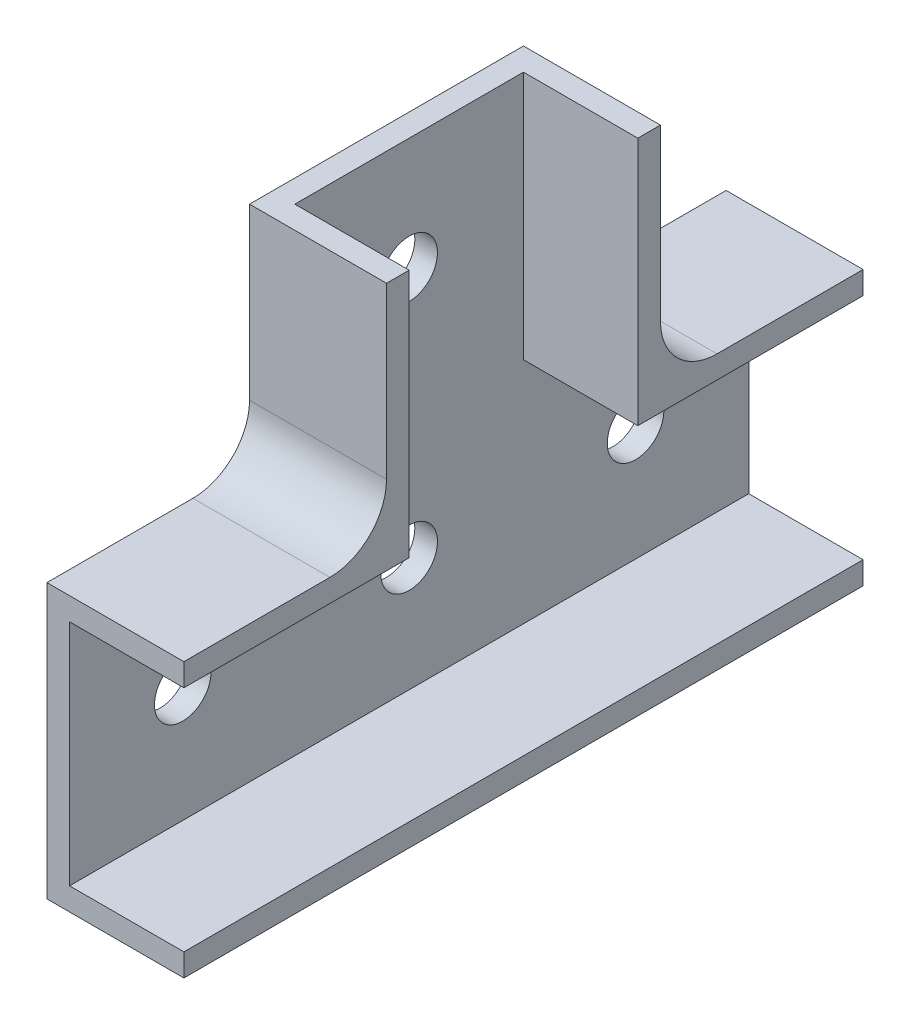
ISO-10303-21;
HEADER;
FILE_DESCRIPTION(('STEP AP214'),'2;1');
FILE_NAME('part.step','',(''),(''),'','','');
FILE_SCHEMA(('AUTOMOTIVE_DESIGN { 1 0 10303 214 1 1 1 1 }'));
ENDSEC;
DATA;
#1=APPLICATION_CONTEXT('core data for automotive mechanical design processes');
#2=APPLICATION_PROTOCOL_DEFINITION('international standard','automotive_design',2000,#1);
#3=PRODUCT_CONTEXT('',#1,'mechanical');
#4=PRODUCT('Part','Part','',(#3));
#5=PRODUCT_RELATED_PRODUCT_CATEGORY('part','',(#4));
#6=PRODUCT_DEFINITION_FORMATION('','',#4);
#7=PRODUCT_DEFINITION_CONTEXT('part definition',#1,'design');
#8=PRODUCT_DEFINITION('design','',#6,#7);
#9=PRODUCT_DEFINITION_SHAPE('','',#8);
#10=(LENGTH_UNIT() NAMED_UNIT(*) SI_UNIT(.MILLI.,.METRE.));
#11=(NAMED_UNIT(*) PLANE_ANGLE_UNIT() SI_UNIT($,.RADIAN.));
#12=(NAMED_UNIT(*) SI_UNIT($,.STERADIAN.) SOLID_ANGLE_UNIT());
#13=UNCERTAINTY_MEASURE_WITH_UNIT(LENGTH_MEASURE(1.E-05),#10,'distance_accuracy_value','');
#14=(GEOMETRIC_REPRESENTATION_CONTEXT(3) GLOBAL_UNCERTAINTY_ASSIGNED_CONTEXT((#13)) GLOBAL_UNIT_ASSIGNED_CONTEXT((#10,
#11,#12)) REPRESENTATION_CONTEXT('',''));
#15=CARTESIAN_POINT('',(0.,0.,0.));
#16=DIRECTION('',(0.,0.,1.));
#17=DIRECTION('',(1.,0.,0.));
#18=AXIS2_PLACEMENT_3D('',#15,#16,#17);
#19=CARTESIAN_POINT('',(-12.1,17.1,67.1));
#20=DIRECTION('',(1.,0.,0.));
#21=DIRECTION('',(0.,1.,0.));
#22=AXIS2_PLACEMENT_3D('',#19,#20,#21);
#23=CYLINDRICAL_SURFACE('',#22,5.);
#24=DIRECTION('',(-1.,0.,0.));
#25=VECTOR('',#24,1.);
#26=CARTESIAN_POINT('',(-12.1,12.1,67.1));
#27=LINE('',#26,#25);
#28=CARTESIAN_POINT('',(0.,12.1,67.1));
#29=VERTEX_POINT('',#28);
#30=CARTESIAN_POINT('',(-12.1,12.1,67.1));
#31=VERTEX_POINT('',#30);
#32=EDGE_CURVE('E260',#29,#31,#27,.T.);
#33=ORIENTED_EDGE('',*,*,#32,.F.);
#34=CARTESIAN_POINT('',(0.,17.1,67.1));
#35=DIRECTION('',(1.,0.,0.));
#36=DIRECTION('',(0.,1.,0.));
#37=AXIS2_PLACEMENT_3D('',#34,#35,#36);
#38=CIRCLE('',#37,5.);
#39=CARTESIAN_POINT('',(0.,17.1,62.1));
#40=VERTEX_POINT('',#39);
#41=EDGE_CURVE('E52',#29,#40,#38,.T.);
#42=ORIENTED_EDGE('',*,*,#41,.T.);
#43=DIRECTION('',(-1.,0.,0.));
#44=VECTOR('',#43,1.);
#45=CARTESIAN_POINT('',(-12.1,17.1,62.1));
#46=LINE('',#45,#44);
#47=CARTESIAN_POINT('',(-12.1,17.1,62.1));
#48=VERTEX_POINT('',#47);
#49=EDGE_CURVE('E264',#48,#40,#46,.F.);
#50=ORIENTED_EDGE('',*,*,#49,.F.);
#51=CARTESIAN_POINT('',(-12.1,17.1,67.1));
#52=DIRECTION('',(1.,0.,0.));
#53=DIRECTION('',(0.,0.,-1.));
#54=AXIS2_PLACEMENT_3D('',#51,#52,#53);
#55=CIRCLE('',#54,5.);
#56=EDGE_CURVE('E11',#48,#31,#55,.F.);
#57=ORIENTED_EDGE('',*,*,#56,.T.);
#58=EDGE_LOOP('',(#33,#42,#50,#57));
#59=FACE_BOUND('',#58,.T.);
#60=ADVANCED_FACE('F44',(#59),#23,.F.);
#61=CARTESIAN_POINT('',(-12.1,17.1,32.9));
#62=DIRECTION('',(1.,0.,0.));
#63=DIRECTION('',(0.,1.,0.));
#64=AXIS2_PLACEMENT_3D('',#61,#62,#63);
#65=CYLINDRICAL_SURFACE('',#64,5.);
#66=DIRECTION('',(-1.,0.,0.));
#67=VECTOR('',#66,1.);
#68=CARTESIAN_POINT('',(-12.1,17.1,37.9));
#69=LINE('',#68,#67);
#70=CARTESIAN_POINT('',(0.,17.1,37.9));
#71=VERTEX_POINT('',#70);
#72=CARTESIAN_POINT('',(-12.1,17.1,37.9));
#73=VERTEX_POINT('',#72);
#74=EDGE_CURVE('E246',#71,#73,#69,.T.);
#75=ORIENTED_EDGE('',*,*,#74,.F.);
#76=CARTESIAN_POINT('',(0.,17.1,32.9));
#77=DIRECTION('',(1.,0.,0.));
#78=DIRECTION('',(0.,1.,0.));
#79=AXIS2_PLACEMENT_3D('',#76,#77,#78);
#80=CIRCLE('',#79,5.);
#81=CARTESIAN_POINT('',(0.,12.1,32.9));
#82=VERTEX_POINT('',#81);
#83=EDGE_CURVE('E254',#71,#82,#80,.T.);
#84=ORIENTED_EDGE('',*,*,#83,.T.);
#85=DIRECTION('',(-1.,0.,0.));
#86=VECTOR('',#85,1.);
#87=CARTESIAN_POINT('',(-12.1,12.1,32.9));
#88=LINE('',#87,#86);
#89=CARTESIAN_POINT('',(-12.1,12.1,32.9));
#90=VERTEX_POINT('',#89);
#91=EDGE_CURVE('E250',#90,#82,#88,.F.);
#92=ORIENTED_EDGE('',*,*,#91,.F.);
#93=CARTESIAN_POINT('',(-12.1,17.1,32.9));
#94=DIRECTION('',(1.,0.,0.));
#95=DIRECTION('',(0.,0.,-1.));
#96=AXIS2_PLACEMENT_3D('',#93,#94,#95);
#97=CIRCLE('',#96,5.);
#98=EDGE_CURVE('E257',#90,#73,#97,.F.);
#99=ORIENTED_EDGE('',*,*,#98,.T.);
#100=EDGE_LOOP('',(#75,#84,#92,#99));
#101=FACE_BOUND('',#100,.T.);
#102=ADVANCED_FACE('F438',(#101),#65,.F.);
#103=CARTESIAN_POINT('',(-10.1,10.1,100.));
#104=DIRECTION('',(0.,-1.,0.));
#105=DIRECTION('',(0.,0.,-1.));
#106=AXIS2_PLACEMENT_3D('',#103,#104,#105);
#107=PLANE('',#106);
#108=DIRECTION('',(0.,0.,-1.));
#109=VECTOR('',#108,1.);
#110=CARTESIAN_POINT('',(-10.1,10.1,100.));
#111=LINE('',#110,#109);
#112=CARTESIAN_POINT('',(-10.1,10.1,80.));
#113=VERTEX_POINT('',#112);
#114=CARTESIAN_POINT('',(-10.1,10.1,60.1));
#115=VERTEX_POINT('',#114);
#116=EDGE_CURVE('E174',#113,#115,#111,.T.);
#117=ORIENTED_EDGE('',*,*,#116,.T.);
#118=DIRECTION('',(1.,0.,0.));
#119=VECTOR('',#118,1.);
#120=CARTESIAN_POINT('',(-10.,10.1,60.1));
#121=LINE('',#120,#119);
#122=CARTESIAN_POINT('',(0.,10.1,60.1));
#123=VERTEX_POINT('',#122);
#124=EDGE_CURVE('E184',#115,#123,#121,.T.);
#125=ORIENTED_EDGE('',*,*,#124,.T.);
#126=DIRECTION('',(0.,0.,1.));
#127=VECTOR('',#126,1.);
#128=CARTESIAN_POINT('',(0.,10.1,100.));
#129=LINE('',#128,#127);
#130=CARTESIAN_POINT('',(0.,10.1,80.));
#131=VERTEX_POINT('',#130);
#132=EDGE_CURVE('E286',#123,#131,#129,.T.);
#133=ORIENTED_EDGE('',*,*,#132,.T.);
#134=DIRECTION('',(-1.,0.,0.));
#135=VECTOR('',#134,1.);
#136=CARTESIAN_POINT('',(-10.1,10.1,80.));
#137=LINE('',#136,#135);
#138=EDGE_CURVE('E194',#131,#113,#137,.T.);
#139=ORIENTED_EDGE('',*,*,#138,.T.);
#140=EDGE_LOOP('',(#117,#125,#133,#139));
#141=FACE_BOUND('',#140,.T.);
#142=ADVANCED_FACE('F192',(#141),#107,.T.);
#143=CARTESIAN_POINT('',(0.,0.,0.));
#144=DIRECTION('',(1.,0.,0.));
#145=DIRECTION('',(0.,1.,0.));
#146=AXIS2_PLACEMENT_3D('',#143,#144,#145);
#147=PLANE('',#146);
#148=ORIENTED_EDGE('',*,*,#41,.F.);
#149=DIRECTION('',(0.,0.,1.));
#150=VECTOR('',#149,1.);
#151=CARTESIAN_POINT('',(0.,12.1,100.));
#152=LINE('',#151,#150);
#153=CARTESIAN_POINT('',(0.,12.1,80.));
#154=VERTEX_POINT('',#153);
#155=EDGE_CURVE('E388',#29,#154,#152,.T.);
#156=ORIENTED_EDGE('',*,*,#155,.T.);
#157=DIRECTION('',(0.,1.,0.));
#158=VECTOR('',#157,1.);
#159=CARTESIAN_POINT('',(0.,0.,80.));
#160=LINE('',#159,#158);
#161=EDGE_CURVE('E287',#131,#154,#160,.T.);
#162=ORIENTED_EDGE('',*,*,#161,.F.);
#163=ORIENTED_EDGE('',*,*,#132,.F.);
#164=DIRECTION('',(0.,-1.,0.));
#165=VECTOR('',#164,1.);
#166=CARTESIAN_POINT('',(0.,52.1,60.1));
#167=LINE('',#166,#165);
#168=CARTESIAN_POINT('',(0.,32.1,60.1));
#169=VERTEX_POINT('',#168);
#170=EDGE_CURVE('E186',#169,#123,#167,.T.);
#171=ORIENTED_EDGE('',*,*,#170,.F.);
#172=DIRECTION('',(0.,0.,1.));
#173=VECTOR('',#172,1.);
#174=CARTESIAN_POINT('',(0.,32.1,0.));
#175=LINE('',#174,#173);
#176=CARTESIAN_POINT('',(0.,32.1,62.1));
#177=VERTEX_POINT('',#176);
#178=EDGE_CURVE('E242',#169,#177,#175,.T.);
#179=ORIENTED_EDGE('',*,*,#178,.T.);
#180=DIRECTION('',(0.,-1.,0.));
#181=VECTOR('',#180,1.);
#182=CARTESIAN_POINT('',(0.,52.1,62.1));
#183=LINE('',#182,#181);
#184=EDGE_CURVE('E382',#177,#40,#183,.T.);
#185=ORIENTED_EDGE('',*,*,#184,.T.);
#186=EDGE_LOOP('',(#148,#156,#162,#163,#171,#179,#185));
#187=FACE_BOUND('',#186,.T.);
#188=ADVANCED_FACE('F445',(#187),#147,.T.);
#189=CARTESIAN_POINT('',(-12.1,12.1,100.));
#190=DIRECTION('',(0.,-1.,0.));
#191=DIRECTION('',(1.,0.,0.));
#192=AXIS2_PLACEMENT_3D('',#189,#190,#191);
#193=PLANE('',#192);
#194=ORIENTED_EDGE('',*,*,#155,.F.);
#195=ORIENTED_EDGE('',*,*,#32,.T.);
#196=DIRECTION('',(0.,0.,-1.));
#197=VECTOR('',#196,1.);
#198=CARTESIAN_POINT('',(-12.1,12.1,100.));
#199=LINE('',#198,#197);
#200=CARTESIAN_POINT('',(-12.1,12.1,80.));
#201=VERTEX_POINT('',#200);
#202=EDGE_CURVE('E202',#201,#31,#199,.T.);
#203=ORIENTED_EDGE('',*,*,#202,.F.);
#204=DIRECTION('',(1.,0.,0.));
#205=VECTOR('',#204,1.);
#206=CARTESIAN_POINT('',(-27.9,12.1,80.));
#207=LINE('',#206,#205);
#208=EDGE_CURVE('E296',#201,#154,#207,.T.);
#209=ORIENTED_EDGE('',*,*,#208,.T.);
#210=EDGE_LOOP('',(#194,#195,#203,#209));
#211=FACE_BOUND('',#210,.T.);
#212=ADVANCED_FACE('F452',(#211),#193,.F.);
#213=CARTESIAN_POINT('',(-12.1,-12.1,100.));
#214=DIRECTION('',(0.,1.,0.));
#215=DIRECTION('',(0.,0.,1.));
#216=AXIS2_PLACEMENT_3D('',#213,#214,#215);
#217=PLANE('',#216);
#218=DIRECTION('',(0.,0.,-1.));
#219=VECTOR('',#218,1.);
#220=CARTESIAN_POINT('',(0.,-12.1,100.));
#221=LINE('',#220,#219);
#222=CARTESIAN_POINT('',(0.,-12.1,80.));
#223=VERTEX_POINT('',#222);
#224=CARTESIAN_POINT('',(0.,-12.1,19.9999999999996));
#225=VERTEX_POINT('',#224);
#226=EDGE_CURVE('E407',#223,#225,#221,.T.);
#227=ORIENTED_EDGE('',*,*,#226,.F.);
#228=DIRECTION('',(1.,0.,0.));
#229=VECTOR('',#228,1.);
#230=CARTESIAN_POINT('',(-27.9,-12.1,80.));
#231=LINE('',#230,#229);
#232=CARTESIAN_POINT('',(-12.1,-12.1,80.));
#233=VERTEX_POINT('',#232);
#234=EDGE_CURVE('E311',#233,#223,#231,.T.);
#235=ORIENTED_EDGE('',*,*,#234,.F.);
#236=DIRECTION('',(0.,0.,-1.));
#237=VECTOR('',#236,1.);
#238=CARTESIAN_POINT('',(-12.1,-12.1,100.));
#239=LINE('',#238,#237);
#240=CARTESIAN_POINT('',(-12.1,-12.1,19.9999999999996));
#241=VERTEX_POINT('',#240);
#242=EDGE_CURVE('E209',#233,#241,#239,.T.);
#243=ORIENTED_EDGE('',*,*,#242,.T.);
#244=DIRECTION('',(1.,0.,0.));
#245=VECTOR('',#244,1.);
#246=CARTESIAN_POINT('',(-27.9,-12.1,19.9999999999996));
#247=LINE('',#246,#245);
#248=EDGE_CURVE('E302',#241,#225,#247,.T.);
#249=ORIENTED_EDGE('',*,*,#248,.T.);
#250=EDGE_LOOP('',(#227,#235,#243,#249));
#251=FACE_BOUND('',#250,.T.);
#252=ADVANCED_FACE('F424',(#251),#217,.F.);
#253=DIRECTION('',(1.,0.,0.));
#254=VECTOR('',#253,1.);
#255=CARTESIAN_POINT('',(-10.,10.1,39.9));
#256=LINE('',#255,#254);
#257=CARTESIAN_POINT('',(-10.1,10.1,39.9));
#258=VERTEX_POINT('',#257);
#259=CARTESIAN_POINT('',(0.,10.1,39.9));
#260=VERTEX_POINT('',#259);
#261=EDGE_CURVE('E190',#258,#260,#256,.T.);
#262=ORIENTED_EDGE('',*,*,#261,.F.);
#263=CARTESIAN_POINT('',(-10.1,10.1,19.9999999999997));
#264=VERTEX_POINT('',#263);
#265=EDGE_CURVE('E198',#258,#264,#111,.T.);
#266=ORIENTED_EDGE('',*,*,#265,.T.);
#267=DIRECTION('',(-1.,0.,0.));
#268=VECTOR('',#267,1.);
#269=CARTESIAN_POINT('',(-10.1,10.1,19.9999999999997));
#270=LINE('',#269,#268);
#271=CARTESIAN_POINT('',(0.,10.1,19.9999999999997));
#272=VERTEX_POINT('',#271);
#273=EDGE_CURVE('E328',#272,#264,#270,.T.);
#274=ORIENTED_EDGE('',*,*,#273,.F.);
#275=EDGE_CURVE('E378',#272,#260,#129,.T.);
#276=ORIENTED_EDGE('',*,*,#275,.T.);
#277=EDGE_LOOP('',(#262,#266,#274,#276));
#278=FACE_BOUND('',#277,.T.);
#279=ADVANCED_FACE('F377',(#278),#107,.T.);
#280=CARTESIAN_POINT('',(-10.1,-10.1,100.));
#281=DIRECTION('',(0.,1.,0.));
#282=DIRECTION('',(0.,0.,1.));
#283=AXIS2_PLACEMENT_3D('',#280,#281,#282);
#284=PLANE('',#283);
#285=DIRECTION('',(1.,0.,0.));
#286=VECTOR('',#285,1.);
#287=CARTESIAN_POINT('',(-10.1,-10.1,80.));
#288=LINE('',#287,#286);
#289=CARTESIAN_POINT('',(-10.1,-10.1,80.));
#290=VERTEX_POINT('',#289);
#291=CARTESIAN_POINT('',(0.,-10.1,80.));
#292=VERTEX_POINT('',#291);
#293=EDGE_CURVE('E213',#290,#292,#288,.T.);
#294=ORIENTED_EDGE('',*,*,#293,.T.);
#295=DIRECTION('',(0.,0.,-1.));
#296=VECTOR('',#295,1.);
#297=CARTESIAN_POINT('',(0.,-10.1,100.));
#298=LINE('',#297,#296);
#299=CARTESIAN_POINT('',(0.,-10.1,19.9999999999996));
#300=VERTEX_POINT('',#299);
#301=EDGE_CURVE('E368',#292,#300,#298,.T.);
#302=ORIENTED_EDGE('',*,*,#301,.T.);
#303=DIRECTION('',(1.,0.,0.));
#304=VECTOR('',#303,1.);
#305=CARTESIAN_POINT('',(-10.1,-10.1,19.9999999999996));
#306=LINE('',#305,#304);
#307=CARTESIAN_POINT('',(-10.1,-10.1,19.9999999999996));
#308=VERTEX_POINT('',#307);
#309=EDGE_CURVE('E235',#308,#300,#306,.T.);
#310=ORIENTED_EDGE('',*,*,#309,.F.);
#311=DIRECTION('',(0.,0.,-1.));
#312=VECTOR('',#311,1.);
#313=CARTESIAN_POINT('',(-10.1,-10.1,100.));
#314=LINE('',#313,#312);
#315=EDGE_CURVE('E204',#290,#308,#314,.T.);
#316=ORIENTED_EDGE('',*,*,#315,.F.);
#317=EDGE_LOOP('',(#294,#302,#310,#316));
#318=FACE_BOUND('',#317,.T.);
#319=ADVANCED_FACE('F366',(#318),#284,.T.);
#320=CARTESIAN_POINT('',(-12.1,12.1,19.9999999999997));
#321=VERTEX_POINT('',#320);
#322=EDGE_CURVE('E197',#90,#321,#199,.T.);
#323=ORIENTED_EDGE('',*,*,#322,.F.);
#324=ORIENTED_EDGE('',*,*,#91,.T.);
#325=DIRECTION('',(0.,0.,1.));
#326=VECTOR('',#325,1.);
#327=CARTESIAN_POINT('',(0.,12.1,100.));
#328=LINE('',#327,#326);
#329=CARTESIAN_POINT('',(0.,12.1,19.9999999999997));
#330=VERTEX_POINT('',#329);
#331=EDGE_CURVE('E401',#330,#82,#328,.T.);
#332=ORIENTED_EDGE('',*,*,#331,.F.);
#333=DIRECTION('',(1.,0.,0.));
#334=VECTOR('',#333,1.);
#335=CARTESIAN_POINT('',(-27.9,12.1,19.9999999999997));
#336=LINE('',#335,#334);
#337=EDGE_CURVE('E307',#321,#330,#336,.T.);
#338=ORIENTED_EDGE('',*,*,#337,.F.);
#339=EDGE_LOOP('',(#323,#324,#332,#338));
#340=FACE_BOUND('',#339,.T.);
#341=ADVANCED_FACE('F434',(#340),#193,.F.);
#342=CARTESIAN_POINT('',(-12.1,52.1,62.1));
#343=DIRECTION('',(0.,0.,-1.));
#344=DIRECTION('',(-1.,0.,0.));
#345=AXIS2_PLACEMENT_3D('',#342,#343,#344);
#346=PLANE('',#345);
#347=DIRECTION('',(0.,-1.,0.));
#348=VECTOR('',#347,1.);
#349=CARTESIAN_POINT('',(-12.1,52.1,62.1));
#350=LINE('',#349,#348);
#351=CARTESIAN_POINT('',(-12.1,32.1,62.1));
#352=VERTEX_POINT('',#351);
#353=EDGE_CURVE('E354',#352,#48,#350,.T.);
#354=ORIENTED_EDGE('',*,*,#353,.T.);
#355=ORIENTED_EDGE('',*,*,#49,.T.);
#356=ORIENTED_EDGE('',*,*,#184,.F.);
#357=DIRECTION('',(1.,0.,0.));
#358=VECTOR('',#357,1.);
#359=CARTESIAN_POINT('',(-27.9,32.1,62.1));
#360=LINE('',#359,#358);
#361=EDGE_CURVE('E411',#352,#177,#360,.T.);
#362=ORIENTED_EDGE('',*,*,#361,.F.);
#363=EDGE_LOOP('',(#354,#355,#356,#362));
#364=FACE_BOUND('',#363,.T.);
#365=ADVANCED_FACE('F443',(#364),#346,.F.);
#366=CARTESIAN_POINT('',(-12.1,52.1,37.9));
#367=DIRECTION('',(0.,0.,1.));
#368=DIRECTION('',(1.,0.,0.));
#369=AXIS2_PLACEMENT_3D('',#366,#367,#368);
#370=PLANE('',#369);
#371=DIRECTION('',(0.,1.,0.));
#372=VECTOR('',#371,1.);
#373=CARTESIAN_POINT('',(0.,52.1,37.9));
#374=LINE('',#373,#372);
#375=CARTESIAN_POINT('',(0.,32.1,37.9));
#376=VERTEX_POINT('',#375);
#377=EDGE_CURVE('E275',#71,#376,#374,.T.);
#378=ORIENTED_EDGE('',*,*,#377,.F.);
#379=ORIENTED_EDGE('',*,*,#74,.T.);
#380=DIRECTION('',(0.,-1.,0.));
#381=VECTOR('',#380,1.);
#382=CARTESIAN_POINT('',(-12.1,52.1,37.9));
#383=LINE('',#382,#381);
#384=CARTESIAN_POINT('',(-12.1,32.1,37.9));
#385=VERTEX_POINT('',#384);
#386=EDGE_CURVE('E351',#385,#73,#383,.T.);
#387=ORIENTED_EDGE('',*,*,#386,.F.);
#388=DIRECTION('',(1.,0.,0.));
#389=VECTOR('',#388,1.);
#390=CARTESIAN_POINT('',(-27.9,32.1,37.9));
#391=LINE('',#390,#389);
#392=EDGE_CURVE('E298',#385,#376,#391,.T.);
#393=ORIENTED_EDGE('',*,*,#392,.T.);
#394=EDGE_LOOP('',(#378,#379,#387,#393));
#395=FACE_BOUND('',#394,.T.);
#396=ADVANCED_FACE('F441',(#395),#370,.F.);
#397=CARTESIAN_POINT('',(-10.1,52.1,39.9));
#398=DIRECTION('',(0.,0.,1.));
#399=DIRECTION('',(1.,0.,0.));
#400=AXIS2_PLACEMENT_3D('',#397,#398,#399);
#401=PLANE('',#400);
#402=DIRECTION('',(0.,-1.,0.));
#403=VECTOR('',#402,1.);
#404=CARTESIAN_POINT('',(-10.1,52.1,39.9));
#405=LINE('',#404,#403);
#406=CARTESIAN_POINT('',(-10.1,32.1,39.9));
#407=VERTEX_POINT('',#406);
#408=EDGE_CURVE('E180',#407,#258,#405,.T.);
#409=ORIENTED_EDGE('',*,*,#408,.T.);
#410=ORIENTED_EDGE('',*,*,#261,.T.);
#411=DIRECTION('',(0.,1.,0.));
#412=VECTOR('',#411,1.);
#413=CARTESIAN_POINT('',(0.,52.1,39.9));
#414=LINE('',#413,#412);
#415=CARTESIAN_POINT('',(0.,32.1,39.9));
#416=VERTEX_POINT('',#415);
#417=EDGE_CURVE('E272',#260,#416,#414,.T.);
#418=ORIENTED_EDGE('',*,*,#417,.T.);
#419=DIRECTION('',(1.,0.,0.));
#420=VECTOR('',#419,1.);
#421=CARTESIAN_POINT('',(-10.1,32.1,39.9));
#422=LINE('',#421,#420);
#423=EDGE_CURVE('E282',#407,#416,#422,.T.);
#424=ORIENTED_EDGE('',*,*,#423,.F.);
#425=EDGE_LOOP('',(#409,#410,#418,#424));
#426=FACE_BOUND('',#425,.T.);
#427=ADVANCED_FACE('F281',(#426),#401,.T.);
#428=CARTESIAN_POINT('',(-10.1,52.1,60.1));
#429=DIRECTION('',(0.,0.,-1.));
#430=DIRECTION('',(-1.,0.,0.));
#431=AXIS2_PLACEMENT_3D('',#428,#429,#430);
#432=PLANE('',#431);
#433=DIRECTION('',(-1.,0.,0.));
#434=VECTOR('',#433,1.);
#435=CARTESIAN_POINT('',(-10.1,32.1,60.1));
#436=LINE('',#435,#434);
#437=CARTESIAN_POINT('',(-10.1,32.1,60.1));
#438=VERTEX_POINT('',#437);
#439=EDGE_CURVE('E239',#169,#438,#436,.T.);
#440=ORIENTED_EDGE('',*,*,#439,.F.);
#441=ORIENTED_EDGE('',*,*,#170,.T.);
#442=ORIENTED_EDGE('',*,*,#124,.F.);
#443=DIRECTION('',(0.,-1.,0.));
#444=VECTOR('',#443,1.);
#445=CARTESIAN_POINT('',(-10.1,52.1,60.1));
#446=LINE('',#445,#444);
#447=EDGE_CURVE('E168',#438,#115,#446,.T.);
#448=ORIENTED_EDGE('',*,*,#447,.F.);
#449=EDGE_LOOP('',(#440,#441,#442,#448));
#450=FACE_BOUND('',#449,.T.);
#451=ADVANCED_FACE('F185',(#450),#432,.T.);
#452=CARTESIAN_POINT('',(-27.9,0.,80.));
#453=DIRECTION('',(0.,0.,1.));
#454=DIRECTION('',(1.,0.,0.));
#455=AXIS2_PLACEMENT_3D('',#452,#453,#454);
#456=PLANE('',#455);
#457=ORIENTED_EDGE('',*,*,#234,.T.);
#458=EDGE_CURVE('E393',#223,#292,#160,.T.);
#459=ORIENTED_EDGE('',*,*,#458,.T.);
#460=ORIENTED_EDGE('',*,*,#293,.F.);
#461=DIRECTION('',(0.,-1.,0.));
#462=VECTOR('',#461,1.);
#463=CARTESIAN_POINT('',(-10.1,-10.1,80.));
#464=LINE('',#463,#462);
#465=EDGE_CURVE('E306',#113,#290,#464,.T.);
#466=ORIENTED_EDGE('',*,*,#465,.F.);
#467=ORIENTED_EDGE('',*,*,#138,.F.);
#468=ORIENTED_EDGE('',*,*,#161,.T.);
#469=ORIENTED_EDGE('',*,*,#208,.F.);
#470=DIRECTION('',(0.,-1.,0.));
#471=VECTOR('',#470,1.);
#472=CARTESIAN_POINT('',(-12.1,-12.1,80.));
#473=LINE('',#472,#471);
#474=EDGE_CURVE('E322',#201,#233,#473,.T.);
#475=ORIENTED_EDGE('',*,*,#474,.T.);
#476=EDGE_LOOP('',(#457,#459,#460,#466,#467,#468,#469,#475));
#477=FACE_BOUND('',#476,.T.);
#478=ADVANCED_FACE('F418',(#477),#456,.T.);
#479=CARTESIAN_POINT('',(-27.9,-1.29831423545921E-13,19.9999999999997));
#480=DIRECTION('',(0.,0.,1.));
#481=DIRECTION('',(0.,-1.,0.));
#482=AXIS2_PLACEMENT_3D('',#479,#480,#481);
#483=PLANE('',#482);
#484=DIRECTION('',(0.,1.,0.));
#485=VECTOR('',#484,1.);
#486=CARTESIAN_POINT('',(0.,-1.31820443768167E-13,19.9999999999997));
#487=LINE('',#486,#485);
#488=EDGE_CURVE('E372',#225,#300,#487,.T.);
#489=ORIENTED_EDGE('',*,*,#488,.F.);
#490=ORIENTED_EDGE('',*,*,#248,.F.);
#491=DIRECTION('',(0.,-1.,0.));
#492=VECTOR('',#491,1.);
#493=CARTESIAN_POINT('',(-12.1,-12.0999999999995,19.9999999999996));
#494=LINE('',#493,#492);
#495=EDGE_CURVE('E231',#321,#241,#494,.T.);
#496=ORIENTED_EDGE('',*,*,#495,.F.);
#497=ORIENTED_EDGE('',*,*,#337,.T.);
#498=EDGE_CURVE('E375',#272,#330,#487,.T.);
#499=ORIENTED_EDGE('',*,*,#498,.F.);
#500=ORIENTED_EDGE('',*,*,#273,.T.);
#501=DIRECTION('',(0.,-1.,0.));
#502=VECTOR('',#501,1.);
#503=CARTESIAN_POINT('',(-10.1,-10.0999999999995,19.9999999999996));
#504=LINE('',#503,#502);
#505=EDGE_CURVE('E325',#264,#308,#504,.T.);
#506=ORIENTED_EDGE('',*,*,#505,.T.);
#507=ORIENTED_EDGE('',*,*,#309,.T.);
#508=EDGE_LOOP('',(#489,#490,#496,#497,#499,#500,#506,#507));
#509=FACE_BOUND('',#508,.T.);
#510=ADVANCED_FACE('F371',(#509),#483,.F.);
#511=CARTESIAN_POINT('',(-27.9,32.1,0.));
#512=DIRECTION('',(0.,-1.,0.));
#513=DIRECTION('',(1.,0.,0.));
#514=AXIS2_PLACEMENT_3D('',#511,#512,#513);
#515=PLANE('',#514);
#516=EDGE_CURVE('E245',#376,#416,#175,.T.);
#517=ORIENTED_EDGE('',*,*,#516,.F.);
#518=ORIENTED_EDGE('',*,*,#392,.F.);
#519=DIRECTION('',(0.,0.,-1.));
#520=VECTOR('',#519,1.);
#521=CARTESIAN_POINT('',(-12.1,32.1,100.));
#522=LINE('',#521,#520);
#523=EDGE_CURVE('E291',#352,#385,#522,.T.);
#524=ORIENTED_EDGE('',*,*,#523,.F.);
#525=ORIENTED_EDGE('',*,*,#361,.T.);
#526=ORIENTED_EDGE('',*,*,#178,.F.);
#527=ORIENTED_EDGE('',*,*,#439,.T.);
#528=DIRECTION('',(0.,0.,-1.));
#529=VECTOR('',#528,1.);
#530=CARTESIAN_POINT('',(-10.1,32.1,60.1));
#531=LINE('',#530,#529);
#532=EDGE_CURVE('E176',#438,#407,#531,.T.);
#533=ORIENTED_EDGE('',*,*,#532,.T.);
#534=ORIENTED_EDGE('',*,*,#423,.T.);
#535=EDGE_LOOP('',(#517,#518,#524,#525,#526,#527,#533,#534));
#536=FACE_BOUND('',#535,.T.);
#537=ADVANCED_FACE('F289',(#536),#515,.F.);
#538=CARTESIAN_POINT('',(-12.1,-12.1,100.));
#539=DIRECTION('',(1.,0.,0.));
#540=DIRECTION('',(0.,0.,-1.));
#541=AXIS2_PLACEMENT_3D('',#538,#539,#540);
#542=PLANE('',#541);
#543=ORIENTED_EDGE('',*,*,#98,.F.);
#544=ORIENTED_EDGE('',*,*,#322,.T.);
#545=ORIENTED_EDGE('',*,*,#495,.T.);
#546=ORIENTED_EDGE('',*,*,#242,.F.);
#547=ORIENTED_EDGE('',*,*,#474,.F.);
#548=ORIENTED_EDGE('',*,*,#202,.T.);
#549=ORIENTED_EDGE('',*,*,#56,.F.);
#550=ORIENTED_EDGE('',*,*,#353,.F.);
#551=ORIENTED_EDGE('',*,*,#523,.T.);
#552=ORIENTED_EDGE('',*,*,#386,.T.);
#553=EDGE_LOOP('',(#543,#544,#545,#546,#547,#548,#549,#550,#551,#552));
#554=FACE_BOUND('',#553,.T.);
#555=CARTESIAN_POINT('',(-12.1,2.22044604925031E-13,70.0000000000004));
#556=DIRECTION('',(-1.,0.,0.));
#557=DIRECTION('',(0.,0.,-1.));
#558=AXIS2_PLACEMENT_3D('',#555,#556,#557);
#559=CIRCLE('',#558,2.50000000000002);
#560=CARTESIAN_POINT('',(-12.1,2.22044604925031E-13,67.5000000000004));
#561=VERTEX_POINT('',#560);
#562=EDGE_CURVE('E342',#561,#561,#559,.T.);
#563=ORIENTED_EDGE('',*,*,#562,.F.);
#564=EDGE_LOOP('',(#563));
#565=FACE_BOUND('',#564,.T.);
#566=CARTESIAN_POINT('',(-12.1,0.,30.));
#567=DIRECTION('',(-1.,0.,0.));
#568=DIRECTION('',(0.,0.,1.));
#569=AXIS2_PLACEMENT_3D('',#566,#567,#568);
#570=CIRCLE('',#569,2.5);
#571=CARTESIAN_POINT('',(-12.1,0.,32.5));
#572=VERTEX_POINT('',#571);
#573=EDGE_CURVE('E219',#572,#572,#570,.T.);
#574=ORIENTED_EDGE('',*,*,#573,.F.);
#575=EDGE_LOOP('',(#574));
#576=FACE_BOUND('',#575,.T.);
#577=CARTESIAN_POINT('',(-12.1,22.1,50.));
#578=DIRECTION('',(-1.,0.,0.));
#579=DIRECTION('',(0.,0.,1.));
#580=AXIS2_PLACEMENT_3D('',#577,#578,#579);
#581=CIRCLE('',#580,2.5);
#582=CARTESIAN_POINT('',(-12.1,22.1,52.5));
#583=VERTEX_POINT('',#582);
#584=EDGE_CURVE('E338',#583,#583,#581,.T.);
#585=ORIENTED_EDGE('',*,*,#584,.F.);
#586=EDGE_LOOP('',(#585));
#587=FACE_BOUND('',#586,.T.);
#588=CARTESIAN_POINT('',(-12.1,0.,50.0000000000056));
#589=DIRECTION('',(1.,0.,0.));
#590=DIRECTION('',(0.,0.,-1.));
#591=AXIS2_PLACEMENT_3D('',#588,#589,#590);
#592=CIRCLE('',#591,2.5);
#593=CARTESIAN_POINT('',(-12.1,0.,47.5000000000056));
#594=VERTEX_POINT('',#593);
#595=EDGE_CURVE('E230',#594,#594,#592,.T.);
#596=ORIENTED_EDGE('',*,*,#595,.T.);
#597=EDGE_LOOP('',(#596));
#598=FACE_BOUND('',#597,.T.);
#599=ADVANCED_FACE('F428',(#554,#565,#576,#587,#598),#542,.F.);
#600=CARTESIAN_POINT('',(-10.1,52.1,60.1));
#601=DIRECTION('',(1.,0.,0.));
#602=DIRECTION('',(0.,1.,0.));
#603=AXIS2_PLACEMENT_3D('',#600,#601,#602);
#604=PLANE('',#603);
#605=ORIENTED_EDGE('',*,*,#532,.F.);
#606=ORIENTED_EDGE('',*,*,#447,.T.);
#607=ORIENTED_EDGE('',*,*,#116,.F.);
#608=ORIENTED_EDGE('',*,*,#465,.T.);
#609=ORIENTED_EDGE('',*,*,#315,.T.);
#610=ORIENTED_EDGE('',*,*,#505,.F.);
#611=ORIENTED_EDGE('',*,*,#265,.F.);
#612=ORIENTED_EDGE('',*,*,#408,.F.);
#613=EDGE_LOOP('',(#605,#606,#607,#608,#609,#610,#611,#612));
#614=FACE_BOUND('',#613,.T.);
#615=CARTESIAN_POINT('',(-10.1,22.1,50.));
#616=DIRECTION('',(1.,0.,0.));
#617=DIRECTION('',(0.,1.,0.));
#618=AXIS2_PLACEMENT_3D('',#615,#616,#617);
#619=CIRCLE('',#618,2.5);
#620=CARTESIAN_POINT('',(-10.1,24.6,50.));
#621=VERTEX_POINT('',#620);
#622=EDGE_CURVE('E214',#621,#621,#619,.T.);
#623=ORIENTED_EDGE('',*,*,#622,.F.);
#624=EDGE_LOOP('',(#623));
#625=FACE_BOUND('',#624,.T.);
#626=CARTESIAN_POINT('',(-10.1,2.22044604925031E-13,70.0000000000004));
#627=DIRECTION('',(1.,0.,0.));
#628=DIRECTION('',(0.,0.,-1.));
#629=AXIS2_PLACEMENT_3D('',#626,#627,#628);
#630=CIRCLE('',#629,2.50000000000002);
#631=CARTESIAN_POINT('',(-10.1,2.22044604925031E-13,67.5000000000004));
#632=VERTEX_POINT('',#631);
#633=EDGE_CURVE('E218',#632,#632,#630,.T.);
#634=ORIENTED_EDGE('',*,*,#633,.F.);
#635=EDGE_LOOP('',(#634));
#636=FACE_BOUND('',#635,.T.);
#637=CARTESIAN_POINT('',(-10.1,0.,30.));
#638=DIRECTION('',(1.,0.,0.));
#639=DIRECTION('',(0.,0.,-1.));
#640=AXIS2_PLACEMENT_3D('',#637,#638,#639);
#641=CIRCLE('',#640,2.5);
#642=CARTESIAN_POINT('',(-10.1,0.,27.5));
#643=VERTEX_POINT('',#642);
#644=EDGE_CURVE('E181',#643,#643,#641,.T.);
#645=ORIENTED_EDGE('',*,*,#644,.F.);
#646=EDGE_LOOP('',(#645));
#647=FACE_BOUND('',#646,.T.);
#648=CARTESIAN_POINT('',(-10.1,0.,50.0000000000056));
#649=DIRECTION('',(1.,0.,0.));
#650=DIRECTION('',(0.,0.,-1.));
#651=AXIS2_PLACEMENT_3D('',#648,#649,#650);
#652=CIRCLE('',#651,2.5);
#653=CARTESIAN_POINT('',(-10.1,0.,47.5000000000056));
#654=VERTEX_POINT('',#653);
#655=EDGE_CURVE('E226',#654,#654,#652,.T.);
#656=ORIENTED_EDGE('',*,*,#655,.F.);
#657=EDGE_LOOP('',(#656));
#658=FACE_BOUND('',#657,.T.);
#659=ADVANCED_FACE('F170',(#614,#625,#636,#647,#658),#604,.T.);
#660=CARTESIAN_POINT('',(27.9,22.1,50.));
#661=DIRECTION('',(-1.,0.,0.));
#662=DIRECTION('',(0.,0.,1.));
#663=AXIS2_PLACEMENT_3D('',#660,#661,#662);
#664=CYLINDRICAL_SURFACE('',#663,2.5);
#665=ORIENTED_EDGE('',*,*,#622,.T.);
#666=EDGE_LOOP('',(#665));
#667=FACE_BOUND('',#666,.T.);
#668=ORIENTED_EDGE('',*,*,#584,.T.);
#669=EDGE_LOOP('',(#668));
#670=FACE_BOUND('',#669,.T.);
#671=ADVANCED_FACE('F482',(#667,#670),#664,.F.);
#672=CARTESIAN_POINT('',(27.9,2.22044604925031E-13,70.0000000000004));
#673=DIRECTION('',(-1.,0.,0.));
#674=DIRECTION('',(0.,0.,1.));
#675=AXIS2_PLACEMENT_3D('',#672,#673,#674);
#676=CYLINDRICAL_SURFACE('',#675,2.50000000000002);
#677=ORIENTED_EDGE('',*,*,#633,.T.);
#678=EDGE_LOOP('',(#677));
#679=FACE_BOUND('',#678,.T.);
#680=ORIENTED_EDGE('',*,*,#562,.T.);
#681=EDGE_LOOP('',(#680));
#682=FACE_BOUND('',#681,.T.);
#683=ADVANCED_FACE('F489',(#679,#682),#676,.F.);
#684=CARTESIAN_POINT('',(27.9,0.,30.));
#685=DIRECTION('',(-1.,0.,0.));
#686=DIRECTION('',(0.,0.,1.));
#687=AXIS2_PLACEMENT_3D('',#684,#685,#686);
#688=CYLINDRICAL_SURFACE('',#687,2.5);
#689=ORIENTED_EDGE('',*,*,#644,.T.);
#690=EDGE_LOOP('',(#689));
#691=FACE_BOUND('',#690,.T.);
#692=ORIENTED_EDGE('',*,*,#573,.T.);
#693=EDGE_LOOP('',(#692));
#694=FACE_BOUND('',#693,.T.);
#695=ADVANCED_FACE('F485',(#691,#694),#688,.F.);
#696=CARTESIAN_POINT('',(-27.9,0.,50.0000000000056));
#697=DIRECTION('',(1.,0.,0.));
#698=DIRECTION('',(0.,1.,0.));
#699=AXIS2_PLACEMENT_3D('',#696,#697,#698);
#700=CYLINDRICAL_SURFACE('',#699,2.5);
#701=ORIENTED_EDGE('',*,*,#655,.T.);
#702=EDGE_LOOP('',(#701));
#703=FACE_BOUND('',#702,.T.);
#704=ORIENTED_EDGE('',*,*,#595,.F.);
#705=EDGE_LOOP('',(#704));
#706=FACE_BOUND('',#705,.T.);
#707=ADVANCED_FACE('F488',(#703,#706),#700,.F.);
#708=ORIENTED_EDGE('',*,*,#83,.F.);
#709=ORIENTED_EDGE('',*,*,#377,.T.);
#710=ORIENTED_EDGE('',*,*,#516,.T.);
#711=ORIENTED_EDGE('',*,*,#417,.F.);
#712=ORIENTED_EDGE('',*,*,#275,.F.);
#713=ORIENTED_EDGE('',*,*,#498,.T.);
#714=ORIENTED_EDGE('',*,*,#331,.T.);
#715=EDGE_LOOP('',(#708,#709,#710,#711,#712,#713,#714));
#716=FACE_BOUND('',#715,.T.);
#717=ADVANCED_FACE('F271',(#716),#147,.T.);
#718=ORIENTED_EDGE('',*,*,#226,.T.);
#719=ORIENTED_EDGE('',*,*,#488,.T.);
#720=ORIENTED_EDGE('',*,*,#301,.F.);
#721=ORIENTED_EDGE('',*,*,#458,.F.);
#722=EDGE_LOOP('',(#718,#719,#720,#721));
#723=FACE_BOUND('',#722,.T.);
#724=ADVANCED_FACE('F422',(#723),#147,.T.);
#725=CLOSED_SHELL('',(#60,#102,#142,#188,#212,#252,#279,#319,#341,#365,#396,#427,#451,#478,#510,
#537,#599,#659,#671,#683,#695,#707,#717,#724));
#726=MANIFOLD_SOLID_BREP('B2',#725);
#727=ADVANCED_BREP_SHAPE_REPRESENTATION('',(#18,#726),#14);
#728=SHAPE_DEFINITION_REPRESENTATION(#9,#727);
ENDSEC;
END-ISO-10303-21;
